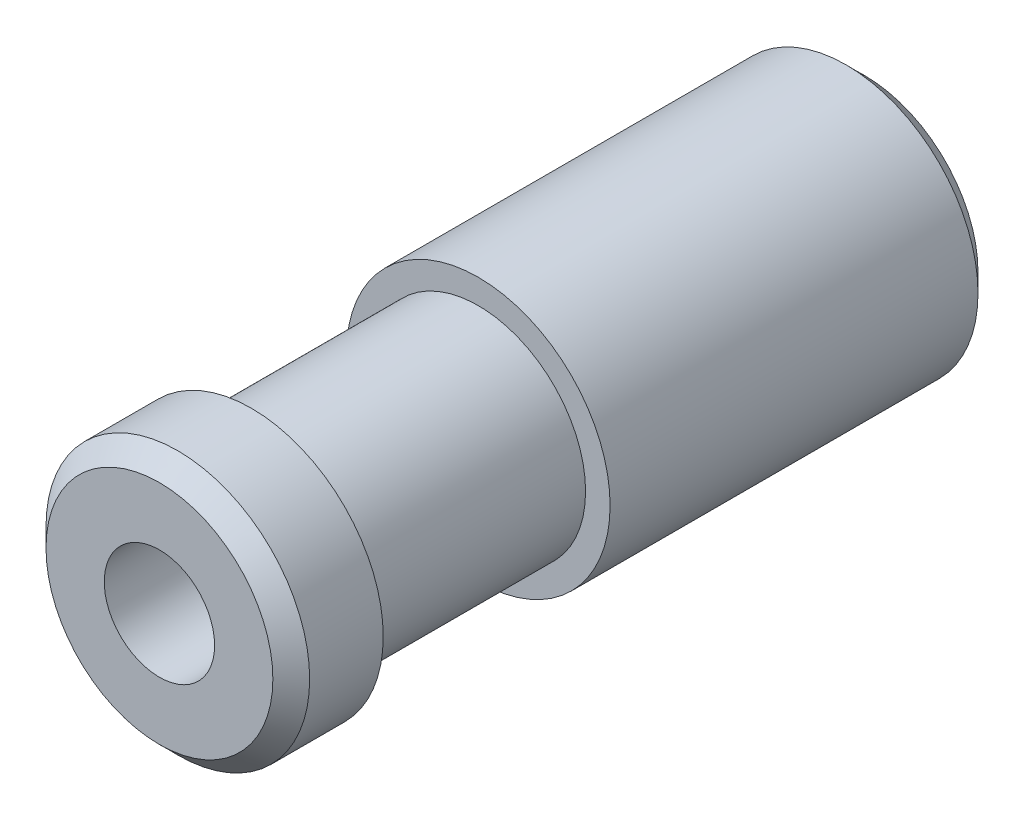
ISO-10303-21;
HEADER;
FILE_DESCRIPTION(('STEP AP214'),'2;1');
FILE_NAME('part.step','',(''),(''),'','','');
FILE_SCHEMA(('AUTOMOTIVE_DESIGN { 1 0 10303 214 1 1 1 1 }'));
ENDSEC;
DATA;
#1=APPLICATION_CONTEXT('core data for automotive mechanical design processes');
#2=APPLICATION_PROTOCOL_DEFINITION('international standard','automotive_design',2000,#1);
#3=PRODUCT_CONTEXT('',#1,'mechanical');
#4=PRODUCT('Part','Part','',(#3));
#5=PRODUCT_RELATED_PRODUCT_CATEGORY('part','',(#4));
#6=PRODUCT_DEFINITION_FORMATION('','',#4);
#7=PRODUCT_DEFINITION_CONTEXT('part definition',#1,'design');
#8=PRODUCT_DEFINITION('design','',#6,#7);
#9=PRODUCT_DEFINITION_SHAPE('','',#8);
#10=(LENGTH_UNIT() NAMED_UNIT(*) SI_UNIT(.MILLI.,.METRE.));
#11=(NAMED_UNIT(*) PLANE_ANGLE_UNIT() SI_UNIT($,.RADIAN.));
#12=(NAMED_UNIT(*) SI_UNIT($,.STERADIAN.) SOLID_ANGLE_UNIT());
#13=UNCERTAINTY_MEASURE_WITH_UNIT(LENGTH_MEASURE(1.E-05),#10,'distance_accuracy_value','');
#14=(GEOMETRIC_REPRESENTATION_CONTEXT(3) GLOBAL_UNCERTAINTY_ASSIGNED_CONTEXT((#13)) GLOBAL_UNIT_ASSIGNED_CONTEXT((#10,
#11,#12)) REPRESENTATION_CONTEXT('',''));
#15=CARTESIAN_POINT('',(0.,0.,0.));
#16=DIRECTION('',(0.,0.,1.));
#17=DIRECTION('',(1.,0.,0.));
#18=AXIS2_PLACEMENT_3D('',#15,#16,#17);
#19=CARTESIAN_POINT('',(0.,0.,5.45000000010987));
#20=DIRECTION('',(0.,0.,-1.));
#21=DIRECTION('',(-1.,0.,0.));
#22=AXIS2_PLACEMENT_3D('',#19,#20,#21);
#23=CONICAL_SURFACE('',#22,2.1499999999719,0.785398163397448);
#24=CARTESIAN_POINT('',(0.,0.,5.45));
#25=DIRECTION('',(0.,0.,1.));
#26=DIRECTION('',(1.,0.,0.));
#27=AXIS2_PLACEMENT_3D('',#24,#25,#26);
#28=CIRCLE('',#27,2.15);
#29=CARTESIAN_POINT('',(2.15,0.,5.45));
#30=VERTEX_POINT('',#29);
#31=EDGE_CURVE('E30',#30,#30,#28,.F.);
#32=ORIENTED_EDGE('',*,*,#31,.F.);
#33=EDGE_LOOP('',(#32));
#34=FACE_BOUND('',#33,.T.);
#35=CARTESIAN_POINT('',(0.,0.,5.7500000000914));
#36=DIRECTION('',(0.,0.,-1.));
#37=DIRECTION('',(-1.,0.,0.));
#38=AXIS2_PLACEMENT_3D('',#35,#36,#37);
#39=CIRCLE('',#38,1.84999999999036);
#40=CARTESIAN_POINT('',(-1.84999999999036,0.,5.7500000000914));
#41=VERTEX_POINT('',#40);
#42=EDGE_CURVE('E17',#41,#41,#39,.F.);
#43=ORIENTED_EDGE('',*,*,#42,.F.);
#44=EDGE_LOOP('',(#43));
#45=FACE_BOUND('',#44,.T.);
#46=ADVANCED_FACE('F14',(#34,#45),#23,.T.);
#47=CARTESIAN_POINT('',(0.,0.,5.75));
#48=DIRECTION('',(0.,0.,1.));
#49=DIRECTION('',(1.,0.,0.));
#50=AXIS2_PLACEMENT_3D('',#47,#48,#49);
#51=PLANE('',#50);
#52=ORIENTED_EDGE('',*,*,#42,.T.);
#53=EDGE_LOOP('',(#52));
#54=FACE_BOUND('',#53,.T.);
#55=CARTESIAN_POINT('',(0.,0.,5.75));
#56=DIRECTION('',(0.,0.,1.));
#57=DIRECTION('',(1.,0.,0.));
#58=AXIS2_PLACEMENT_3D('',#55,#56,#57);
#59=CIRCLE('',#58,0.9);
#60=CARTESIAN_POINT('',(0.9,0.,5.75));
#61=VERTEX_POINT('',#60);
#62=EDGE_CURVE('E44',#61,#61,#59,.F.);
#63=ORIENTED_EDGE('',*,*,#62,.T.);
#64=EDGE_LOOP('',(#63));
#65=FACE_BOUND('',#64,.T.);
#66=ADVANCED_FACE('F54',(#54,#65),#51,.T.);
#67=CARTESIAN_POINT('',(0.,0.,-6.325));
#68=DIRECTION('',(0.,0.,1.));
#69=DIRECTION('',(1.,0.,0.));
#70=AXIS2_PLACEMENT_3D('',#67,#68,#69);
#71=CYLINDRICAL_SURFACE('',#70,2.15);
#72=ORIENTED_EDGE('',*,*,#31,.T.);
#73=EDGE_LOOP('',(#72));
#74=FACE_BOUND('',#73,.T.);
#75=CARTESIAN_POINT('',(0.,0.,4.25));
#76=DIRECTION('',(0.,0.,1.));
#77=DIRECTION('',(1.,0.,0.));
#78=AXIS2_PLACEMENT_3D('',#75,#76,#77);
#79=CIRCLE('',#78,2.15);
#80=CARTESIAN_POINT('',(2.15,0.,4.25));
#81=VERTEX_POINT('',#80);
#82=EDGE_CURVE('E42',#81,#81,#79,.T.);
#83=ORIENTED_EDGE('',*,*,#82,.T.);
#84=EDGE_LOOP('',(#83));
#85=FACE_BOUND('',#84,.T.);
#86=ADVANCED_FACE('F62',(#74,#85),#71,.T.);
#87=CARTESIAN_POINT('',(0.,0.,-6.325));
#88=DIRECTION('',(0.,0.,1.));
#89=DIRECTION('',(1.,0.,0.));
#90=AXIS2_PLACEMENT_3D('',#87,#88,#89);
#91=CYLINDRICAL_SURFACE('',#90,0.9);
#92=ORIENTED_EDGE('',*,*,#62,.F.);
#93=EDGE_LOOP('',(#92));
#94=FACE_BOUND('',#93,.T.);
#95=CARTESIAN_POINT('',(0.,0.,-5.75));
#96=DIRECTION('',(0.,0.,1.));
#97=DIRECTION('',(1.,0.,0.));
#98=AXIS2_PLACEMENT_3D('',#95,#96,#97);
#99=CIRCLE('',#98,0.9);
#100=CARTESIAN_POINT('',(0.9,0.,-5.75));
#101=VERTEX_POINT('',#100);
#102=EDGE_CURVE('E39',#101,#101,#99,.F.);
#103=ORIENTED_EDGE('',*,*,#102,.T.);
#104=EDGE_LOOP('',(#103));
#105=FACE_BOUND('',#104,.T.);
#106=ADVANCED_FACE('F89',(#94,#105),#91,.F.);
#107=CARTESIAN_POINT('',(0.,0.,4.25));
#108=DIRECTION('',(0.,0.,1.));
#109=DIRECTION('',(1.,0.,0.));
#110=AXIS2_PLACEMENT_3D('',#107,#108,#109);
#111=PLANE('',#110);
#112=ORIENTED_EDGE('',*,*,#82,.F.);
#113=EDGE_LOOP('',(#112));
#114=FACE_BOUND('',#113,.T.);
#115=CARTESIAN_POINT('',(0.,0.,4.25));
#116=DIRECTION('',(0.,0.,1.));
#117=DIRECTION('',(1.,0.,0.));
#118=AXIS2_PLACEMENT_3D('',#115,#116,#117);
#119=CIRCLE('',#118,1.75);
#120=CARTESIAN_POINT('',(1.75,0.,4.25));
#121=VERTEX_POINT('',#120);
#122=EDGE_CURVE('E36',#121,#121,#119,.F.);
#123=ORIENTED_EDGE('',*,*,#122,.F.);
#124=EDGE_LOOP('',(#123));
#125=FACE_BOUND('',#124,.T.);
#126=ADVANCED_FACE('F85',(#114,#125),#111,.F.);
#127=CARTESIAN_POINT('',(0.,0.,-5.75));
#128=DIRECTION('',(0.,0.,1.));
#129=DIRECTION('',(1.,0.,0.));
#130=AXIS2_PLACEMENT_3D('',#127,#128,#129);
#131=PLANE('',#130);
#132=CARTESIAN_POINT('',(0.,0.,-5.7500000000914));
#133=DIRECTION('',(0.,0.,1.));
#134=DIRECTION('',(1.,0.,0.));
#135=AXIS2_PLACEMENT_3D('',#132,#133,#134);
#136=CIRCLE('',#135,1.84999999999036);
#137=CARTESIAN_POINT('',(1.84999999999036,0.,-5.7500000000914));
#138=VERTEX_POINT('',#137);
#139=EDGE_CURVE('E33',#138,#138,#136,.T.);
#140=ORIENTED_EDGE('',*,*,#139,.F.);
#141=EDGE_LOOP('',(#140));
#142=FACE_BOUND('',#141,.T.);
#143=ORIENTED_EDGE('',*,*,#102,.F.);
#144=EDGE_LOOP('',(#143));
#145=FACE_BOUND('',#144,.T.);
#146=ADVANCED_FACE('F81',(#142,#145),#131,.F.);
#147=CARTESIAN_POINT('',(0.,0.,-6.325));
#148=DIRECTION('',(0.,0.,1.));
#149=DIRECTION('',(1.,0.,0.));
#150=AXIS2_PLACEMENT_3D('',#147,#148,#149);
#151=CYLINDRICAL_SURFACE('',#150,1.75);
#152=ORIENTED_EDGE('',*,*,#122,.T.);
#153=EDGE_LOOP('',(#152));
#154=FACE_BOUND('',#153,.T.);
#155=CARTESIAN_POINT('',(0.,0.,0.55));
#156=DIRECTION('',(0.,0.,1.));
#157=DIRECTION('',(1.,0.,0.));
#158=AXIS2_PLACEMENT_3D('',#155,#156,#157);
#159=CIRCLE('',#158,1.75);
#160=CARTESIAN_POINT('',(1.75,0.,0.55));
#161=VERTEX_POINT('',#160);
#162=EDGE_CURVE('E26',#161,#161,#159,.F.);
#163=ORIENTED_EDGE('',*,*,#162,.F.);
#164=EDGE_LOOP('',(#163));
#165=FACE_BOUND('',#164,.T.);
#166=ADVANCED_FACE('F77',(#154,#165),#151,.T.);
#167=CARTESIAN_POINT('',(0.,0.,-5.45000000010987));
#168=DIRECTION('',(0.,0.,1.));
#169=DIRECTION('',(1.,0.,0.));
#170=AXIS2_PLACEMENT_3D('',#167,#168,#169);
#171=CONICAL_SURFACE('',#170,2.1499999999719,0.785398163397448);
#172=CARTESIAN_POINT('',(0.,0.,-5.45));
#173=DIRECTION('',(0.,0.,1.));
#174=DIRECTION('',(1.,0.,0.));
#175=AXIS2_PLACEMENT_3D('',#172,#173,#174);
#176=CIRCLE('',#175,2.15);
#177=CARTESIAN_POINT('',(2.15,0.,-5.45));
#178=VERTEX_POINT('',#177);
#179=EDGE_CURVE('E21',#178,#178,#176,.T.);
#180=ORIENTED_EDGE('',*,*,#179,.F.);
#181=EDGE_LOOP('',(#180));
#182=FACE_BOUND('',#181,.T.);
#183=ORIENTED_EDGE('',*,*,#139,.T.);
#184=EDGE_LOOP('',(#183));
#185=FACE_BOUND('',#184,.T.);
#186=ADVANCED_FACE('F70',(#182,#185),#171,.T.);
#187=CARTESIAN_POINT('',(0.,0.,0.55));
#188=DIRECTION('',(0.,0.,1.));
#189=DIRECTION('',(1.,0.,0.));
#190=AXIS2_PLACEMENT_3D('',#187,#188,#189);
#191=PLANE('',#190);
#192=CARTESIAN_POINT('',(0.,0.,0.55));
#193=DIRECTION('',(0.,0.,1.));
#194=DIRECTION('',(1.,0.,0.));
#195=AXIS2_PLACEMENT_3D('',#192,#193,#194);
#196=CIRCLE('',#195,2.15);
#197=CARTESIAN_POINT('',(2.15,0.,0.55));
#198=VERTEX_POINT('',#197);
#199=EDGE_CURVE('E9',#198,#198,#196,.F.);
#200=ORIENTED_EDGE('',*,*,#199,.F.);
#201=EDGE_LOOP('',(#200));
#202=FACE_BOUND('',#201,.T.);
#203=ORIENTED_EDGE('',*,*,#162,.T.);
#204=EDGE_LOOP('',(#203));
#205=FACE_BOUND('',#204,.T.);
#206=ADVANCED_FACE('F65',(#202,#205),#191,.T.);
#207=CARTESIAN_POINT('',(0.,0.,-6.325));
#208=DIRECTION('',(0.,0.,1.));
#209=DIRECTION('',(1.,0.,0.));
#210=AXIS2_PLACEMENT_3D('',#207,#208,#209);
#211=CYLINDRICAL_SURFACE('',#210,2.15);
#212=ORIENTED_EDGE('',*,*,#199,.T.);
#213=EDGE_LOOP('',(#212));
#214=FACE_BOUND('',#213,.T.);
#215=ORIENTED_EDGE('',*,*,#179,.T.);
#216=EDGE_LOOP('',(#215));
#217=FACE_BOUND('',#216,.T.);
#218=ADVANCED_FACE('F63',(#214,#217),#211,.T.);
#219=CLOSED_SHELL('',(#46,#66,#86,#106,#126,#146,#166,#186,#206,#218));
#220=MANIFOLD_SOLID_BREP('B1',#219);
#221=ADVANCED_BREP_SHAPE_REPRESENTATION('',(#18,#220),#14);
#222=SHAPE_DEFINITION_REPRESENTATION(#9,#221);
ENDSEC;
END-ISO-10303-21;
